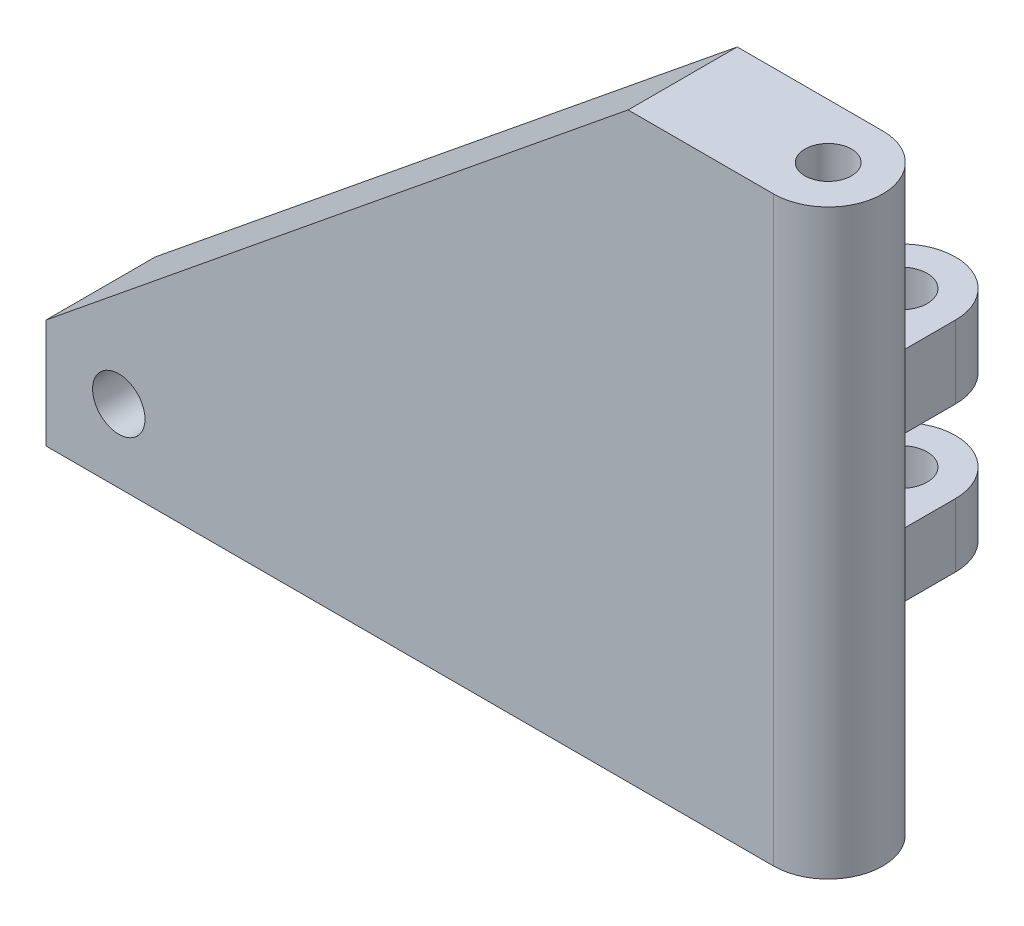
ISO-10303-21;
HEADER;
FILE_DESCRIPTION(('STEP AP214'),'2;1');
FILE_NAME('part.step','',(''),(''),'','','');
FILE_SCHEMA(('AUTOMOTIVE_DESIGN { 1 0 10303 214 1 1 1 1 }'));
ENDSEC;
DATA;
#1=APPLICATION_CONTEXT('core data for automotive mechanical design processes');
#2=APPLICATION_PROTOCOL_DEFINITION('international standard','automotive_design',2000,#1);
#3=PRODUCT_CONTEXT('',#1,'mechanical');
#4=PRODUCT('Part','Part','',(#3));
#5=PRODUCT_RELATED_PRODUCT_CATEGORY('part','',(#4));
#6=PRODUCT_DEFINITION_FORMATION('','',#4);
#7=PRODUCT_DEFINITION_CONTEXT('part definition',#1,'design');
#8=PRODUCT_DEFINITION('design','',#6,#7);
#9=PRODUCT_DEFINITION_SHAPE('','',#8);
#10=(LENGTH_UNIT() NAMED_UNIT(*) SI_UNIT(.MILLI.,.METRE.));
#11=(NAMED_UNIT(*) PLANE_ANGLE_UNIT() SI_UNIT($,.RADIAN.));
#12=(NAMED_UNIT(*) SI_UNIT($,.STERADIAN.) SOLID_ANGLE_UNIT());
#13=UNCERTAINTY_MEASURE_WITH_UNIT(LENGTH_MEASURE(1.E-05),#10,'distance_accuracy_value','');
#14=(GEOMETRIC_REPRESENTATION_CONTEXT(3) GLOBAL_UNCERTAINTY_ASSIGNED_CONTEXT((#13)) GLOBAL_UNIT_ASSIGNED_CONTEXT((#10,
#11,#12)) REPRESENTATION_CONTEXT('',''));
#15=CARTESIAN_POINT('',(0.,0.,0.));
#16=DIRECTION('',(0.,0.,1.));
#17=DIRECTION('',(1.,0.,0.));
#18=AXIS2_PLACEMENT_3D('',#15,#16,#17);
#19=CARTESIAN_POINT('',(-19.05,-6.35,-25.4));
#20=DIRECTION('',(0.,-1.,0.));
#21=DIRECTION('',(0.,0.,-1.));
#22=AXIS2_PLACEMENT_3D('',#19,#20,#21);
#23=CYLINDRICAL_SURFACE('',#22,4.7625);
#24=CARTESIAN_POINT('',(-19.05,-19.84375,-25.4));
#25=DIRECTION('',(0.,1.,0.));
#26=DIRECTION('',(0.,0.,1.));
#27=AXIS2_PLACEMENT_3D('',#24,#25,#26);
#28=CIRCLE('',#27,4.7625);
#29=CARTESIAN_POINT('',(-14.2875,-19.84375,-25.4));
#30=VERTEX_POINT('',#29);
#31=CARTESIAN_POINT('',(-23.8125,-19.84375,-25.4));
#32=VERTEX_POINT('',#31);
#33=EDGE_CURVE('E333',#30,#32,#28,.T.);
#34=ORIENTED_EDGE('',*,*,#33,.F.);
#35=DIRECTION('',(0.,-1.,0.));
#36=VECTOR('',#35,1.);
#37=CARTESIAN_POINT('',(-14.2875,-6.35,-25.4));
#38=LINE('',#37,#36);
#39=CARTESIAN_POINT('',(-14.2875,-25.4,-25.4));
#40=VERTEX_POINT('',#39);
#41=EDGE_CURVE('E275',#30,#40,#38,.T.);
#42=ORIENTED_EDGE('',*,*,#41,.T.);
#43=CARTESIAN_POINT('',(-19.05,-25.4,-25.4));
#44=DIRECTION('',(0.,1.,0.));
#45=DIRECTION('',(0.,0.,1.));
#46=AXIS2_PLACEMENT_3D('',#43,#44,#45);
#47=CIRCLE('',#46,4.7625);
#48=CARTESIAN_POINT('',(-23.8125,-25.4,-25.4));
#49=VERTEX_POINT('',#48);
#50=EDGE_CURVE('E255',#40,#49,#47,.T.);
#51=ORIENTED_EDGE('',*,*,#50,.T.);
#52=DIRECTION('',(0.,-1.,0.));
#53=VECTOR('',#52,1.);
#54=CARTESIAN_POINT('',(-23.8125,-6.35,-25.4));
#55=LINE('',#54,#53);
#56=EDGE_CURVE('E297',#32,#49,#55,.T.);
#57=ORIENTED_EDGE('',*,*,#56,.F.);
#58=EDGE_LOOP('',(#34,#42,#51,#57));
#59=FACE_BOUND('',#58,.T.);
#60=ADVANCED_FACE('F49',(#59),#23,.T.);
#61=CARTESIAN_POINT('',(-23.8125,-6.35,-25.4));
#62=DIRECTION('',(1.,0.,0.));
#63=DIRECTION('',(0.,0.,-1.));
#64=AXIS2_PLACEMENT_3D('',#61,#62,#63);
#65=PLANE('',#64);
#66=DIRECTION('',(0.,0.,1.));
#67=VECTOR('',#66,1.);
#68=CARTESIAN_POINT('',(-23.8125,-19.84375,-25.4));
#69=LINE('',#68,#67);
#70=CARTESIAN_POINT('',(-23.8125,-19.84375,-21.199869793685));
#71=VERTEX_POINT('',#70);
#72=EDGE_CURVE('E242',#32,#71,#69,.T.);
#73=ORIENTED_EDGE('',*,*,#72,.F.);
#74=ORIENTED_EDGE('',*,*,#56,.T.);
#75=DIRECTION('',(0.,0.,1.));
#76=VECTOR('',#75,1.);
#77=CARTESIAN_POINT('',(-23.8125,-25.4,-25.4));
#78=LINE('',#77,#76);
#79=CARTESIAN_POINT('',(-23.8125,-25.4,-4.7625));
#80=VERTEX_POINT('',#79);
#81=EDGE_CURVE('E279',#49,#80,#78,.T.);
#82=ORIENTED_EDGE('',*,*,#81,.T.);
#83=DIRECTION('',(0.,-1.,0.));
#84=VECTOR('',#83,1.);
#85=CARTESIAN_POINT('',(-23.8125,-6.35,-4.7625));
#86=LINE('',#85,#84);
#87=CARTESIAN_POINT('',(-23.8125,-6.35,-4.7625));
#88=VERTEX_POINT('',#87);
#89=EDGE_CURVE('E294',#88,#80,#86,.T.);
#90=ORIENTED_EDGE('',*,*,#89,.F.);
#91=DIRECTION('',(0.,0.,1.));
#92=VECTOR('',#91,1.);
#93=CARTESIAN_POINT('',(-23.8125,-6.35,-25.4));
#94=LINE('',#93,#92);
#95=CARTESIAN_POINT('',(-23.8125,-6.35,-25.4));
#96=VERTEX_POINT('',#95);
#97=EDGE_CURVE('E263',#96,#88,#94,.T.);
#98=ORIENTED_EDGE('',*,*,#97,.F.);
#99=CARTESIAN_POINT('',(-23.8125,-12.7,-25.4));
#100=VERTEX_POINT('',#99);
#101=EDGE_CURVE('E298',#96,#100,#55,.T.);
#102=ORIENTED_EDGE('',*,*,#101,.T.);
#103=DIRECTION('',(0.,0.,1.));
#104=VECTOR('',#103,1.);
#105=CARTESIAN_POINT('',(-23.8125,-12.7,-25.4));
#106=LINE('',#105,#104);
#107=CARTESIAN_POINT('',(-23.8125,-12.7,-21.199869793685));
#108=VERTEX_POINT('',#107);
#109=EDGE_CURVE('E237',#100,#108,#106,.T.);
#110=ORIENTED_EDGE('',*,*,#109,.T.);
#111=DIRECTION('',(0.,1.,0.));
#112=VECTOR('',#111,1.);
#113=CARTESIAN_POINT('',(-23.8125,-19.84375,-21.199869793685));
#114=LINE('',#113,#112);
#115=EDGE_CURVE('E219',#71,#108,#114,.T.);
#116=ORIENTED_EDGE('',*,*,#115,.F.);
#117=EDGE_LOOP('',(#73,#74,#82,#90,#98,#102,#110,#116));
#118=FACE_BOUND('',#117,.T.);
#119=ADVANCED_FACE('F354',(#118),#65,.F.);
#120=CARTESIAN_POINT('',(-14.2875,-6.35,-25.4));
#121=DIRECTION('',(-1.,0.,0.));
#122=DIRECTION('',(0.,0.,1.));
#123=AXIS2_PLACEMENT_3D('',#120,#121,#122);
#124=PLANE('',#123);
#125=DIRECTION('',(0.,0.,-1.));
#126=VECTOR('',#125,1.);
#127=CARTESIAN_POINT('',(-14.2875,-19.84375,-15.3180209242761));
#128=LINE('',#127,#126);
#129=CARTESIAN_POINT('',(-14.2875,-19.84375,-15.3180209242761));
#130=VERTEX_POINT('',#129);
#131=EDGE_CURVE('E330',#130,#30,#128,.T.);
#132=ORIENTED_EDGE('',*,*,#131,.F.);
#133=DIRECTION('',(0.,1.,0.));
#134=VECTOR('',#133,1.);
#135=CARTESIAN_POINT('',(-14.2875,-19.84375,-15.3180209242761));
#136=LINE('',#135,#134);
#137=CARTESIAN_POINT('',(-14.2875,-12.7,-15.3180209242761));
#138=VERTEX_POINT('',#137);
#139=EDGE_CURVE('E226',#130,#138,#136,.T.);
#140=ORIENTED_EDGE('',*,*,#139,.T.);
#141=DIRECTION('',(0.,0.,-1.));
#142=VECTOR('',#141,1.);
#143=CARTESIAN_POINT('',(-14.2875,-12.7,-15.3180209242761));
#144=LINE('',#143,#142);
#145=CARTESIAN_POINT('',(-14.2875,-12.7,-25.4));
#146=VERTEX_POINT('',#145);
#147=EDGE_CURVE('E345',#138,#146,#144,.T.);
#148=ORIENTED_EDGE('',*,*,#147,.T.);
#149=CARTESIAN_POINT('',(-14.2875,-6.35,-25.4));
#150=VERTEX_POINT('',#149);
#151=EDGE_CURVE('E286',#150,#146,#38,.T.);
#152=ORIENTED_EDGE('',*,*,#151,.F.);
#153=DIRECTION('',(0.,0.,-1.));
#154=VECTOR('',#153,1.);
#155=CARTESIAN_POINT('',(-14.2875,-6.35,-25.4));
#156=LINE('',#155,#154);
#157=CARTESIAN_POINT('',(-14.2875,-6.35,-4.7625));
#158=VERTEX_POINT('',#157);
#159=EDGE_CURVE('E272',#158,#150,#156,.T.);
#160=ORIENTED_EDGE('',*,*,#159,.F.);
#161=DIRECTION('',(0.,-1.,0.));
#162=VECTOR('',#161,1.);
#163=CARTESIAN_POINT('',(-14.2875,-6.35,-4.7625));
#164=LINE('',#163,#162);
#165=CARTESIAN_POINT('',(-14.2875,-25.4,-4.7625));
#166=VERTEX_POINT('',#165);
#167=EDGE_CURVE('E290',#158,#166,#164,.T.);
#168=ORIENTED_EDGE('',*,*,#167,.T.);
#169=DIRECTION('',(0.,0.,-1.));
#170=VECTOR('',#169,1.);
#171=CARTESIAN_POINT('',(-14.2875,-25.4,-25.4));
#172=LINE('',#171,#170);
#173=EDGE_CURVE('E264',#166,#40,#172,.T.);
#174=ORIENTED_EDGE('',*,*,#173,.T.);
#175=ORIENTED_EDGE('',*,*,#41,.F.);
#176=EDGE_LOOP('',(#132,#140,#148,#152,#160,#168,#174,#175));
#177=FACE_BOUND('',#176,.T.);
#178=ADVANCED_FACE('F374',(#177),#124,.F.);
#179=CARTESIAN_POINT('',(-19.05,-6.35,-25.4));
#180=DIRECTION('',(0.,-1.,0.));
#181=DIRECTION('',(0.,0.,-1.));
#182=AXIS2_PLACEMENT_3D('',#179,#180,#181);
#183=CYLINDRICAL_SURFACE('',#182,2.286);
#184=CARTESIAN_POINT('',(-19.05,-25.4,-25.4));
#185=DIRECTION('',(0.,1.,0.));
#186=DIRECTION('',(0.,0.,1.));
#187=AXIS2_PLACEMENT_3D('',#184,#185,#186);
#188=CIRCLE('',#187,2.286);
#189=CARTESIAN_POINT('',(-19.05,-25.4,-27.686));
#190=VERTEX_POINT('',#189);
#191=EDGE_CURVE('E250',#190,#190,#188,.T.);
#192=CARTESIAN_POINT('',(-19.05,-19.84375,-25.4));
#193=DIRECTION('',(0.,1.,0.));
#194=DIRECTION('',(0.,0.,1.));
#195=AXIS2_PLACEMENT_3D('',#192,#193,#194);
#196=CIRCLE('',#195,2.286);
#197=CARTESIAN_POINT('',(-19.05,-19.84375,-27.686));
#198=VERTEX_POINT('',#197);
#199=EDGE_CURVE('E53',#198,#198,#196,.T.);
#200=CARTESIAN_POINT('',(-19.05,-25.4,-27.686));
#201=CARTESIAN_POINT('',(-19.05,-25.3421223958333,-27.686));
#202=CARTESIAN_POINT('',(-19.05,-25.2842447916667,-27.686));
#203=CARTESIAN_POINT('',(-19.05,-25.1684895833333,-27.686));
#204=CARTESIAN_POINT('',(-19.05,-25.1106119791667,-27.686));
#205=CARTESIAN_POINT('',(-19.05,-24.9948567708333,-27.686));
#206=CARTESIAN_POINT('',(-19.05,-24.9369791666667,-27.686));
#207=CARTESIAN_POINT('',(-19.05,-24.8212239583333,-27.686));
#208=CARTESIAN_POINT('',(-19.05,-24.7633463541667,-27.686));
#209=CARTESIAN_POINT('',(-19.05,-24.6475911458333,-27.686));
#210=CARTESIAN_POINT('',(-19.05,-24.5897135416667,-27.686));
#211=CARTESIAN_POINT('',(-19.05,-24.4739583333333,-27.686));
#212=CARTESIAN_POINT('',(-19.05,-24.4160807291667,-27.686));
#213=CARTESIAN_POINT('',(-19.05,-24.3003255208333,-27.686));
#214=CARTESIAN_POINT('',(-19.05,-24.2424479166667,-27.686));
#215=CARTESIAN_POINT('',(-19.05,-24.1266927083333,-27.686));
#216=CARTESIAN_POINT('',(-19.05,-24.0688151041667,-27.686));
#217=CARTESIAN_POINT('',(-19.05,-23.9530598958333,-27.686));
#218=CARTESIAN_POINT('',(-19.05,-23.8951822916667,-27.686));
#219=CARTESIAN_POINT('',(-19.05,-23.7794270833333,-27.686));
#220=CARTESIAN_POINT('',(-19.05,-23.7215494791667,-27.686));
#221=CARTESIAN_POINT('',(-19.05,-23.6057942708333,-27.686));
#222=CARTESIAN_POINT('',(-19.05,-23.5479166666667,-27.686));
#223=CARTESIAN_POINT('',(-19.05,-23.4321614583333,-27.686));
#224=CARTESIAN_POINT('',(-19.05,-23.3742838541667,-27.686));
#225=CARTESIAN_POINT('',(-19.05,-23.2585286458333,-27.686));
#226=CARTESIAN_POINT('',(-19.05,-23.2006510416667,-27.686));
#227=CARTESIAN_POINT('',(-19.05,-23.0848958333333,-27.686));
#228=CARTESIAN_POINT('',(-19.05,-23.0270182291667,-27.686));
#229=CARTESIAN_POINT('',(-19.05,-22.9112630208333,-27.686));
#230=CARTESIAN_POINT('',(-19.05,-22.8533854166667,-27.686));
#231=CARTESIAN_POINT('',(-19.05,-22.7376302083333,-27.686));
#232=CARTESIAN_POINT('',(-19.05,-22.6797526041667,-27.686));
#233=CARTESIAN_POINT('',(-19.05,-22.5639973958333,-27.686));
#234=CARTESIAN_POINT('',(-19.05,-22.5061197916667,-27.686));
#235=CARTESIAN_POINT('',(-19.05,-22.3903645833333,-27.686));
#236=CARTESIAN_POINT('',(-19.05,-22.3324869791667,-27.686));
#237=CARTESIAN_POINT('',(-19.05,-22.2167317708333,-27.686));
#238=CARTESIAN_POINT('',(-19.05,-22.1588541666667,-27.686));
#239=CARTESIAN_POINT('',(-19.05,-22.0430989583333,-27.686));
#240=CARTESIAN_POINT('',(-19.05,-21.9852213541667,-27.686));
#241=CARTESIAN_POINT('',(-19.05,-21.8694661458333,-27.686));
#242=CARTESIAN_POINT('',(-19.05,-21.8115885416667,-27.686));
#243=CARTESIAN_POINT('',(-19.05,-21.6958333333333,-27.686));
#244=CARTESIAN_POINT('',(-19.05,-21.6379557291667,-27.686));
#245=CARTESIAN_POINT('',(-19.05,-21.5222005208333,-27.686));
#246=CARTESIAN_POINT('',(-19.05,-21.4643229166667,-27.686));
#247=CARTESIAN_POINT('',(-19.05,-21.3485677083333,-27.686));
#248=CARTESIAN_POINT('',(-19.05,-21.2906901041667,-27.686));
#249=CARTESIAN_POINT('',(-19.05,-21.1749348958333,-27.686));
#250=CARTESIAN_POINT('',(-19.05,-21.1170572916667,-27.686));
#251=CARTESIAN_POINT('',(-19.05,-21.0013020833333,-27.686));
#252=CARTESIAN_POINT('',(-19.05,-20.9434244791667,-27.686));
#253=CARTESIAN_POINT('',(-19.05,-20.8276692708333,-27.686));
#254=CARTESIAN_POINT('',(-19.05,-20.7697916666667,-27.686));
#255=CARTESIAN_POINT('',(-19.05,-20.6540364583333,-27.686));
#256=CARTESIAN_POINT('',(-19.05,-20.5961588541667,-27.686));
#257=CARTESIAN_POINT('',(-19.05,-20.4804036458333,-27.686));
#258=CARTESIAN_POINT('',(-19.05,-20.4225260416667,-27.686));
#259=CARTESIAN_POINT('',(-19.05,-20.3067708333333,-27.686));
#260=CARTESIAN_POINT('',(-19.05,-20.2488932291667,-27.686));
#261=CARTESIAN_POINT('',(-19.05,-20.1331380208333,-27.686));
#262=CARTESIAN_POINT('',(-19.05,-20.0752604166667,-27.686));
#263=CARTESIAN_POINT('',(-19.05,-19.9595052083333,-27.686));
#264=CARTESIAN_POINT('',(-19.05,-19.9016276041667,-27.686));
#265=CARTESIAN_POINT('',(-19.05,-19.84375,-27.686));
#266=B_SPLINE_CURVE_WITH_KNOTS('',3,(#200,#201,#202,#203,#204,#205,#206,#207,#208,#209,#210,
#211,#212,#213,#214,#215,#216,#217,#218,#219,#220,#221,#222,#223,#224,#225,#226,#227,#228,#229,
#230,#231,#232,#233,#234,#235,#236,#237,#238,#239,#240,#241,#242,#243,#244,#245,#246,#247,#248,
#249,#250,#251,#252,#253,#254,#255,#256,#257,#258,#259,#260,#261,#262,#263,#264,#265),
.UNSPECIFIED.,.F.,.F.,(4,2,2,2,2,2,2,2,2,2,2,2,2,2,2,2,2,2,2,2,2,2,2,2,2,2,2,2,2,2,2,2,4),(0.,
0.173632812500001,0.347265624999999,0.5208984375,0.694531249999998,0.868164062499999,
1.041796875,1.2154296875,1.3890625,1.5626953125,1.736328125,1.9099609375,2.08359375,
2.2572265625,2.430859375,2.6044921875,2.778125,2.9517578125,3.125390625,3.2990234375,3.47265625,
3.6462890625,3.819921875,3.9935546875,4.1671875,4.3408203125,4.514453125,4.6880859375,
4.86171875,5.0353515625,5.208984375,5.3826171875,5.55625),.UNSPECIFIED.);
#267=EDGE_CURVE('BSEAM399',#190,#198,#266,.T.);
#268=ORIENTED_EDGE('',*,*,#191,.F.);
#269=ORIENTED_EDGE('',*,*,#199,.T.);
#270=ORIENTED_EDGE('',*,*,#267,.T.);
#271=ORIENTED_EDGE('',*,*,#267,.F.);
#272=EDGE_LOOP('',(#268,#270,#269,#271));
#273=FACE_BOUND('',#272,.T.);
#274=ADVANCED_FACE('F399',(#273),#183,.F.);
#275=CARTESIAN_POINT('',(0.,25.4,-4.7625));
#276=DIRECTION('',(0.,0.,1.));
#277=DIRECTION('',(1.,0.,0.));
#278=AXIS2_PLACEMENT_3D('',#275,#276,#277);
#279=PLANE('',#278);
#280=CARTESIAN_POINT('',(-57.15,-19.05,-4.76249999999999));
#281=DIRECTION('',(0.,0.,1.));
#282=DIRECTION('',(1.,0.,0.));
#283=AXIS2_PLACEMENT_3D('',#280,#281,#282);
#284=CIRCLE('',#283,2.286);
#285=CARTESIAN_POINT('',(-54.864,-19.05,-4.76249999999999));
#286=VERTEX_POINT('',#285);
#287=EDGE_CURVE('E246',#286,#286,#284,.T.);
#288=ORIENTED_EDGE('',*,*,#287,.T.);
#289=EDGE_LOOP('',(#288));
#290=FACE_BOUND('',#289,.T.);
#291=DIRECTION('',(0.,-1.,0.));
#292=VECTOR('',#291,1.);
#293=CARTESIAN_POINT('',(-63.5,25.4,-4.76249999999999));
#294=LINE('',#293,#292);
#295=CARTESIAN_POINT('',(-63.5,-15.875,-4.76249999999999));
#296=VERTEX_POINT('',#295);
#297=CARTESIAN_POINT('',(-63.5,-25.4,-4.76249999999999));
#298=VERTEX_POINT('',#297);
#299=EDGE_CURVE('E59',#296,#298,#294,.T.);
#300=ORIENTED_EDGE('',*,*,#299,.F.);
#301=DIRECTION('',(-0.776114000116265,-0.630592625094466,0.));
#302=VECTOR('',#301,1.);
#303=CARTESIAN_POINT('',(-12.7,25.4,-4.7625));
#304=LINE('',#303,#302);
#305=CARTESIAN_POINT('',(-12.7,25.4,-4.7625));
#306=VERTEX_POINT('',#305);
#307=EDGE_CURVE('E171',#306,#296,#304,.T.);
#308=ORIENTED_EDGE('',*,*,#307,.F.);
#309=DIRECTION('',(-1.,0.,0.));
#310=VECTOR('',#309,1.);
#311=CARTESIAN_POINT('',(0.,25.4,-4.7625));
#312=LINE('',#311,#310);
#313=CARTESIAN_POINT('',(0.,25.4,-4.7625));
#314=VERTEX_POINT('',#313);
#315=EDGE_CURVE('E180',#314,#306,#312,.T.);
#316=ORIENTED_EDGE('',*,*,#315,.F.);
#317=DIRECTION('',(0.,-1.,0.));
#318=VECTOR('',#317,1.);
#319=CARTESIAN_POINT('',(0.,25.4,-4.7625));
#320=LINE('',#319,#318);
#321=CARTESIAN_POINT('',(0.,-25.4,-4.7625));
#322=VERTEX_POINT('',#321);
#323=EDGE_CURVE('E11',#314,#322,#320,.T.);
#324=ORIENTED_EDGE('',*,*,#323,.T.);
#325=DIRECTION('',(-1.,0.,0.));
#326=VECTOR('',#325,1.);
#327=CARTESIAN_POINT('',(0.,-25.4,-4.7625));
#328=LINE('',#327,#326);
#329=EDGE_CURVE('E203',#322,#166,#328,.T.);
#330=ORIENTED_EDGE('',*,*,#329,.T.);
#331=ORIENTED_EDGE('',*,*,#167,.F.);
#332=DIRECTION('',(1.,0.,0.));
#333=VECTOR('',#332,1.);
#334=CARTESIAN_POINT('',(-23.8125,-6.35,-4.7625));
#335=LINE('',#334,#333);
#336=EDGE_CURVE('E268',#88,#158,#335,.T.);
#337=ORIENTED_EDGE('',*,*,#336,.F.);
#338=ORIENTED_EDGE('',*,*,#89,.T.);
#339=EDGE_CURVE('E201',#80,#298,#328,.T.);
#340=ORIENTED_EDGE('',*,*,#339,.T.);
#341=EDGE_LOOP('',(#300,#308,#316,#324,#330,#331,#337,#338,#340));
#342=FACE_BOUND('',#341,.T.);
#343=ADVANCED_FACE('F314',(#290,#342),#279,.F.);
#344=CARTESIAN_POINT('',(0.,25.4,0.));
#345=DIRECTION('',(0.,1.,0.));
#346=DIRECTION('',(0.,0.,1.));
#347=AXIS2_PLACEMENT_3D('',#344,#345,#346);
#348=PLANE('',#347);
#349=DIRECTION('',(0.,0.,-1.));
#350=VECTOR('',#349,1.);
#351=CARTESIAN_POINT('',(-12.7,25.4,4.76250000000001));
#352=LINE('',#351,#350);
#353=CARTESIAN_POINT('',(-12.7,25.4,4.76250000000001));
#354=VERTEX_POINT('',#353);
#355=EDGE_CURVE('E165',#354,#306,#352,.T.);
#356=ORIENTED_EDGE('',*,*,#355,.F.);
#357=DIRECTION('',(1.,0.,0.));
#358=VECTOR('',#357,1.);
#359=CARTESIAN_POINT('',(0.,25.4,4.7625));
#360=LINE('',#359,#358);
#361=CARTESIAN_POINT('',(0.,25.4,4.7625));
#362=VERTEX_POINT('',#361);
#363=EDGE_CURVE('E178',#354,#362,#360,.T.);
#364=ORIENTED_EDGE('',*,*,#363,.T.);
#365=CARTESIAN_POINT('',(0.,25.4,0.));
#366=DIRECTION('',(0.,1.,0.));
#367=DIRECTION('',(0.,0.,1.));
#368=AXIS2_PLACEMENT_3D('',#365,#366,#367);
#369=CIRCLE('',#368,4.7625);
#370=EDGE_CURVE('E193',#362,#314,#369,.T.);
#371=ORIENTED_EDGE('',*,*,#370,.T.);
#372=ORIENTED_EDGE('',*,*,#315,.T.);
#373=EDGE_LOOP('',(#356,#364,#371,#372));
#374=FACE_BOUND('',#373,.T.);
#375=CARTESIAN_POINT('',(0.,25.4,0.));
#376=DIRECTION('',(0.,1.,0.));
#377=DIRECTION('',(0.,0.,1.));
#378=AXIS2_PLACEMENT_3D('',#375,#376,#377);
#379=CIRCLE('',#378,2.032);
#380=CARTESIAN_POINT('',(0.,25.4,2.032));
#381=VERTEX_POINT('',#380);
#382=EDGE_CURVE('E202',#381,#381,#379,.T.);
#383=ORIENTED_EDGE('',*,*,#382,.F.);
#384=EDGE_LOOP('',(#383));
#385=FACE_BOUND('',#384,.T.);
#386=ADVANCED_FACE('F175',(#374,#385),#348,.T.);
#387=CARTESIAN_POINT('',(0.,-25.4,0.));
#388=DIRECTION('',(0.,1.,0.));
#389=DIRECTION('',(0.,0.,1.));
#390=AXIS2_PLACEMENT_3D('',#387,#388,#389);
#391=PLANE('',#390);
#392=CARTESIAN_POINT('',(0.,-25.4,0.));
#393=DIRECTION('',(0.,1.,0.));
#394=DIRECTION('',(0.,0.,1.));
#395=AXIS2_PLACEMENT_3D('',#392,#393,#394);
#396=CIRCLE('',#395,4.7625);
#397=CARTESIAN_POINT('',(0.,-25.4,4.7625));
#398=VERTEX_POINT('',#397);
#399=EDGE_CURVE('E197',#398,#322,#396,.T.);
#400=ORIENTED_EDGE('',*,*,#399,.F.);
#401=DIRECTION('',(1.,0.,0.));
#402=VECTOR('',#401,1.);
#403=CARTESIAN_POINT('',(0.,-25.4,4.7625));
#404=LINE('',#403,#402);
#405=CARTESIAN_POINT('',(-63.5,-25.4,4.76250000000001));
#406=VERTEX_POINT('',#405);
#407=EDGE_CURVE('E210',#406,#398,#404,.T.);
#408=ORIENTED_EDGE('',*,*,#407,.F.);
#409=DIRECTION('',(0.,0.,1.));
#410=VECTOR('',#409,1.);
#411=CARTESIAN_POINT('',(-63.5,-25.4,-4.76249999999999));
#412=LINE('',#411,#410);
#413=EDGE_CURVE('E206',#298,#406,#412,.T.);
#414=ORIENTED_EDGE('',*,*,#413,.F.);
#415=ORIENTED_EDGE('',*,*,#339,.F.);
#416=ORIENTED_EDGE('',*,*,#81,.F.);
#417=ORIENTED_EDGE('',*,*,#50,.F.);
#418=ORIENTED_EDGE('',*,*,#173,.F.);
#419=ORIENTED_EDGE('',*,*,#329,.F.);
#420=EDGE_LOOP('',(#400,#408,#414,#415,#416,#417,#418,#419));
#421=FACE_BOUND('',#420,.T.);
#422=CARTESIAN_POINT('',(0.,-25.4,0.));
#423=DIRECTION('',(0.,1.,0.));
#424=DIRECTION('',(0.,0.,1.));
#425=AXIS2_PLACEMENT_3D('',#422,#423,#424);
#426=CIRCLE('',#425,2.032);
#427=CARTESIAN_POINT('',(0.,-25.4,2.032));
#428=VERTEX_POINT('',#427);
#429=EDGE_CURVE('E302',#428,#428,#426,.T.);
#430=ORIENTED_EDGE('',*,*,#429,.T.);
#431=EDGE_LOOP('',(#430));
#432=FACE_BOUND('',#431,.T.);
#433=ORIENTED_EDGE('',*,*,#191,.T.);
#434=EDGE_LOOP('',(#433));
#435=FACE_BOUND('',#434,.T.);
#436=ADVANCED_FACE('F377',(#421,#432,#435),#391,.F.);
#437=CARTESIAN_POINT('',(0.,25.4,0.));
#438=DIRECTION('',(0.,-1.,0.));
#439=DIRECTION('',(0.,0.,-1.));
#440=AXIS2_PLACEMENT_3D('',#437,#438,#439);
#441=CYLINDRICAL_SURFACE('',#440,4.7625);
#442=ORIENTED_EDGE('',*,*,#399,.T.);
#443=ORIENTED_EDGE('',*,*,#323,.F.);
#444=ORIENTED_EDGE('',*,*,#370,.F.);
#445=DIRECTION('',(0.,-1.,0.));
#446=VECTOR('',#445,1.);
#447=CARTESIAN_POINT('',(0.,25.4,4.7625));
#448=LINE('',#447,#446);
#449=EDGE_CURVE('E185',#362,#398,#448,.T.);
#450=ORIENTED_EDGE('',*,*,#449,.T.);
#451=EDGE_LOOP('',(#442,#443,#444,#450));
#452=FACE_BOUND('',#451,.T.);
#453=ADVANCED_FACE('F51',(#452),#441,.T.);
#454=CARTESIAN_POINT('',(-63.5,25.4,-4.76249999999999));
#455=DIRECTION('',(1.,0.,0.));
#456=DIRECTION('',(0.,0.,-1.));
#457=AXIS2_PLACEMENT_3D('',#454,#455,#456);
#458=PLANE('',#457);
#459=DIRECTION('',(0.,-1.,0.));
#460=VECTOR('',#459,1.);
#461=CARTESIAN_POINT('',(-63.5,25.4,4.76250000000001));
#462=LINE('',#461,#460);
#463=CARTESIAN_POINT('',(-63.5,-15.875,4.76250000000001));
#464=VERTEX_POINT('',#463);
#465=EDGE_CURVE('E191',#464,#406,#462,.T.);
#466=ORIENTED_EDGE('',*,*,#465,.F.);
#467=DIRECTION('',(0.,0.,-1.));
#468=VECTOR('',#467,1.);
#469=CARTESIAN_POINT('',(-63.5,-15.875,4.76250000000002));
#470=LINE('',#469,#468);
#471=EDGE_CURVE('E67',#464,#296,#470,.T.);
#472=ORIENTED_EDGE('',*,*,#471,.T.);
#473=ORIENTED_EDGE('',*,*,#299,.T.);
#474=ORIENTED_EDGE('',*,*,#413,.T.);
#475=EDGE_LOOP('',(#466,#472,#473,#474));
#476=FACE_BOUND('',#475,.T.);
#477=ADVANCED_FACE('F434',(#476),#458,.F.);
#478=CARTESIAN_POINT('',(0.,25.4,4.7625));
#479=DIRECTION('',(0.,0.,-1.));
#480=DIRECTION('',(-1.,0.,0.));
#481=AXIS2_PLACEMENT_3D('',#478,#479,#480);
#482=PLANE('',#481);
#483=CARTESIAN_POINT('',(-57.15,-19.05,4.7625));
#484=DIRECTION('',(0.,0.,1.));
#485=DIRECTION('',(1.,0.,0.));
#486=AXIS2_PLACEMENT_3D('',#483,#484,#485);
#487=CIRCLE('',#486,2.286);
#488=CARTESIAN_POINT('',(-54.864,-19.05,4.7625));
#489=VERTEX_POINT('',#488);
#490=EDGE_CURVE('E225',#489,#489,#487,.T.);
#491=ORIENTED_EDGE('',*,*,#490,.F.);
#492=EDGE_LOOP('',(#491));
#493=FACE_BOUND('',#492,.T.);
#494=ORIENTED_EDGE('',*,*,#363,.F.);
#495=DIRECTION('',(-0.776114000116265,-0.630592625094466,0.));
#496=VECTOR('',#495,1.);
#497=CARTESIAN_POINT('',(-12.7,25.4,4.76250000000001));
#498=LINE('',#497,#496);
#499=EDGE_CURVE('E162',#354,#464,#498,.T.);
#500=ORIENTED_EDGE('',*,*,#499,.T.);
#501=ORIENTED_EDGE('',*,*,#465,.T.);
#502=ORIENTED_EDGE('',*,*,#407,.T.);
#503=ORIENTED_EDGE('',*,*,#449,.F.);
#504=EDGE_LOOP('',(#494,#500,#501,#502,#503));
#505=FACE_BOUND('',#504,.T.);
#506=ADVANCED_FACE('F183',(#493,#505),#482,.F.);
#507=CARTESIAN_POINT('',(0.,25.4,0.));
#508=DIRECTION('',(0.,-1.,0.));
#509=DIRECTION('',(0.,0.,-1.));
#510=AXIS2_PLACEMENT_3D('',#507,#508,#509);
#511=CYLINDRICAL_SURFACE('',#510,2.032);
#512=ORIENTED_EDGE('',*,*,#382,.T.);
#513=EDGE_LOOP('',(#512));
#514=FACE_BOUND('',#513,.T.);
#515=ORIENTED_EDGE('',*,*,#429,.F.);
#516=EDGE_LOOP('',(#515));
#517=FACE_BOUND('',#516,.T.);
#518=ADVANCED_FACE('F401',(#514,#517),#511,.F.);
#519=CARTESIAN_POINT('',(-19.05,-6.35,-25.4));
#520=DIRECTION('',(0.,1.,0.));
#521=DIRECTION('',(0.,0.,1.));
#522=AXIS2_PLACEMENT_3D('',#519,#520,#521);
#523=PLANE('',#522);
#524=CARTESIAN_POINT('',(-19.05,-6.35,-25.4));
#525=DIRECTION('',(0.,1.,0.));
#526=DIRECTION('',(0.,0.,1.));
#527=AXIS2_PLACEMENT_3D('',#524,#525,#526);
#528=CIRCLE('',#527,4.7625);
#529=EDGE_CURVE('E259',#150,#96,#528,.T.);
#530=ORIENTED_EDGE('',*,*,#529,.T.);
#531=ORIENTED_EDGE('',*,*,#97,.T.);
#532=ORIENTED_EDGE('',*,*,#336,.T.);
#533=ORIENTED_EDGE('',*,*,#159,.T.);
#534=EDGE_LOOP('',(#530,#531,#532,#533));
#535=FACE_BOUND('',#534,.T.);
#536=CARTESIAN_POINT('',(-19.05,-6.35,-25.4));
#537=DIRECTION('',(0.,1.,0.));
#538=DIRECTION('',(0.,0.,1.));
#539=AXIS2_PLACEMENT_3D('',#536,#537,#538);
#540=CIRCLE('',#539,2.286);
#541=CARTESIAN_POINT('',(-19.05,-6.35,-27.686));
#542=VERTEX_POINT('',#541);
#543=EDGE_CURVE('E251',#542,#542,#540,.T.);
#544=ORIENTED_EDGE('',*,*,#543,.F.);
#545=EDGE_LOOP('',(#544));
#546=FACE_BOUND('',#545,.T.);
#547=ADVANCED_FACE('F383',(#535,#546),#523,.T.);
#548=ORIENTED_EDGE('',*,*,#151,.T.);
#549=CARTESIAN_POINT('',(-19.05,-12.7,-25.4));
#550=DIRECTION('',(0.,1.,0.));
#551=DIRECTION('',(0.,0.,1.));
#552=AXIS2_PLACEMENT_3D('',#549,#550,#551);
#553=CIRCLE('',#552,4.7625);
#554=EDGE_CURVE('E77',#146,#100,#553,.T.);
#555=ORIENTED_EDGE('',*,*,#554,.T.);
#556=ORIENTED_EDGE('',*,*,#101,.F.);
#557=ORIENTED_EDGE('',*,*,#529,.F.);
#558=EDGE_LOOP('',(#548,#555,#556,#557));
#559=FACE_BOUND('',#558,.T.);
#560=ADVANCED_FACE('F387',(#559),#23,.T.);
#561=CARTESIAN_POINT('',(-19.05,-12.7,-25.4));
#562=DIRECTION('',(0.,1.,0.));
#563=DIRECTION('',(0.,0.,1.));
#564=AXIS2_PLACEMENT_3D('',#561,#562,#563);
#565=CIRCLE('',#564,2.286);
#566=CARTESIAN_POINT('',(-19.05,-12.7,-27.686));
#567=VERTEX_POINT('',#566);
#568=EDGE_CURVE('E216',#567,#567,#565,.T.);
#569=CARTESIAN_POINT('',(-19.05,-12.7,-27.686));
#570=CARTESIAN_POINT('',(-19.05,-12.6338541666667,-27.686));
#571=CARTESIAN_POINT('',(-19.05,-12.5677083333333,-27.686));
#572=CARTESIAN_POINT('',(-19.05,-12.4354166666667,-27.686));
#573=CARTESIAN_POINT('',(-19.05,-12.3692708333333,-27.686));
#574=CARTESIAN_POINT('',(-19.05,-12.2369791666667,-27.686));
#575=CARTESIAN_POINT('',(-19.05,-12.1708333333333,-27.686));
#576=CARTESIAN_POINT('',(-19.05,-12.0385416666667,-27.686));
#577=CARTESIAN_POINT('',(-19.05,-11.9723958333333,-27.686));
#578=CARTESIAN_POINT('',(-19.05,-11.8401041666667,-27.686));
#579=CARTESIAN_POINT('',(-19.05,-11.7739583333333,-27.686));
#580=CARTESIAN_POINT('',(-19.05,-11.6416666666667,-27.686));
#581=CARTESIAN_POINT('',(-19.05,-11.5755208333333,-27.686));
#582=CARTESIAN_POINT('',(-19.05,-11.4432291666667,-27.686));
#583=CARTESIAN_POINT('',(-19.05,-11.3770833333333,-27.686));
#584=CARTESIAN_POINT('',(-19.05,-11.2447916666667,-27.686));
#585=CARTESIAN_POINT('',(-19.05,-11.1786458333333,-27.686));
#586=CARTESIAN_POINT('',(-19.05,-11.0463541666667,-27.686));
#587=CARTESIAN_POINT('',(-19.05,-10.9802083333333,-27.686));
#588=CARTESIAN_POINT('',(-19.05,-10.8479166666667,-27.686));
#589=CARTESIAN_POINT('',(-19.05,-10.7817708333333,-27.686));
#590=CARTESIAN_POINT('',(-19.05,-10.6494791666667,-27.686));
#591=CARTESIAN_POINT('',(-19.05,-10.5833333333333,-27.686));
#592=CARTESIAN_POINT('',(-19.05,-10.4510416666667,-27.686));
#593=CARTESIAN_POINT('',(-19.05,-10.3848958333333,-27.686));
#594=CARTESIAN_POINT('',(-19.05,-10.2526041666667,-27.686));
#595=CARTESIAN_POINT('',(-19.05,-10.1864583333333,-27.686));
#596=CARTESIAN_POINT('',(-19.05,-10.0541666666667,-27.686));
#597=CARTESIAN_POINT('',(-19.05,-9.98802083333333,-27.686));
#598=CARTESIAN_POINT('',(-19.05,-9.85572916666667,-27.686));
#599=CARTESIAN_POINT('',(-19.05,-9.78958333333333,-27.686));
#600=CARTESIAN_POINT('',(-19.05,-9.65729166666667,-27.686));
#601=CARTESIAN_POINT('',(-19.05,-9.59114583333333,-27.686));
#602=CARTESIAN_POINT('',(-19.05,-9.45885416666667,-27.686));
#603=CARTESIAN_POINT('',(-19.05,-9.39270833333333,-27.686));
#604=CARTESIAN_POINT('',(-19.05,-9.26041666666667,-27.686));
#605=CARTESIAN_POINT('',(-19.05,-9.19427083333333,-27.686));
#606=CARTESIAN_POINT('',(-19.05,-9.06197916666667,-27.686));
#607=CARTESIAN_POINT('',(-19.05,-8.99583333333333,-27.686));
#608=CARTESIAN_POINT('',(-19.05,-8.86354166666666,-27.686));
#609=CARTESIAN_POINT('',(-19.05,-8.79739583333333,-27.686));
#610=CARTESIAN_POINT('',(-19.05,-8.66510416666667,-27.686));
#611=CARTESIAN_POINT('',(-19.05,-8.59895833333333,-27.686));
#612=CARTESIAN_POINT('',(-19.05,-8.46666666666667,-27.686));
#613=CARTESIAN_POINT('',(-19.05,-8.40052083333333,-27.686));
#614=CARTESIAN_POINT('',(-19.05,-8.26822916666666,-27.686));
#615=CARTESIAN_POINT('',(-19.05,-8.20208333333333,-27.686));
#616=CARTESIAN_POINT('',(-19.05,-8.06979166666667,-27.686));
#617=CARTESIAN_POINT('',(-19.05,-8.00364583333333,-27.686));
#618=CARTESIAN_POINT('',(-19.05,-7.87135416666667,-27.686));
#619=CARTESIAN_POINT('',(-19.05,-7.80520833333333,-27.686));
#620=CARTESIAN_POINT('',(-19.05,-7.67291666666667,-27.686));
#621=CARTESIAN_POINT('',(-19.05,-7.60677083333333,-27.686));
#622=CARTESIAN_POINT('',(-19.05,-7.47447916666667,-27.686));
#623=CARTESIAN_POINT('',(-19.05,-7.40833333333333,-27.686));
#624=CARTESIAN_POINT('',(-19.05,-7.27604166666667,-27.686));
#625=CARTESIAN_POINT('',(-19.05,-7.20989583333333,-27.686));
#626=CARTESIAN_POINT('',(-19.05,-7.07760416666667,-27.686));
#627=CARTESIAN_POINT('',(-19.05,-7.01145833333333,-27.686));
#628=CARTESIAN_POINT('',(-19.05,-6.87916666666667,-27.686));
#629=CARTESIAN_POINT('',(-19.05,-6.81302083333333,-27.686));
#630=CARTESIAN_POINT('',(-19.05,-6.68072916666666,-27.686));
#631=CARTESIAN_POINT('',(-19.05,-6.61458333333333,-27.686));
#632=CARTESIAN_POINT('',(-19.05,-6.48229166666667,-27.686));
#633=CARTESIAN_POINT('',(-19.05,-6.41614583333333,-27.686));
#634=CARTESIAN_POINT('',(-19.05,-6.35,-27.686));
#635=B_SPLINE_CURVE_WITH_KNOTS('',3,(#569,#570,#571,#572,#573,#574,#575,#576,#577,#578,#579,
#580,#581,#582,#583,#584,#585,#586,#587,#588,#589,#590,#591,#592,#593,#594,#595,#596,#597,#598,
#599,#600,#601,#602,#603,#604,#605,#606,#607,#608,#609,#610,#611,#612,#613,#614,#615,#616,#617,
#618,#619,#620,#621,#622,#623,#624,#625,#626,#627,#628,#629,#630,#631,#632,#633,#634),
.UNSPECIFIED.,.F.,.F.,(4,2,2,2,2,2,2,2,2,2,2,2,2,2,2,2,2,2,2,2,2,2,2,2,2,2,2,2,2,2,2,2,4),(0.,
0.198437499999999,0.396875,0.5953125,0.793749999999999,0.992187499999998,1.190625,1.3890625,
1.5875,1.7859375,1.984375,2.1828125,2.38125,2.5796875,2.778125,2.9765625,3.175,3.3734375,
3.571875,3.7703125,3.96875,4.1671875,4.365625,4.5640625,4.7625,4.9609375,5.159375,5.3578125,
5.55625,5.7546875,5.953125,6.1515625,6.35),.UNSPECIFIED.);
#636=EDGE_CURVE('BSEAM389',#567,#542,#635,.T.);
#637=ORIENTED_EDGE('',*,*,#568,.F.);
#638=ORIENTED_EDGE('',*,*,#543,.T.);
#639=ORIENTED_EDGE('',*,*,#636,.T.);
#640=ORIENTED_EDGE('',*,*,#636,.F.);
#641=EDGE_LOOP('',(#637,#639,#638,#640));
#642=FACE_BOUND('',#641,.T.);
#643=ADVANCED_FACE('F389',(#642),#183,.F.);
#644=CARTESIAN_POINT('',(-57.15,-19.05,-30.1625));
#645=DIRECTION('',(0.,0.,1.));
#646=DIRECTION('',(1.,0.,0.));
#647=AXIS2_PLACEMENT_3D('',#644,#645,#646);
#648=CYLINDRICAL_SURFACE('',#647,2.286);
#649=ORIENTED_EDGE('',*,*,#490,.T.);
#650=EDGE_LOOP('',(#649));
#651=FACE_BOUND('',#650,.T.);
#652=ORIENTED_EDGE('',*,*,#287,.F.);
#653=EDGE_LOOP('',(#652));
#654=FACE_BOUND('',#653,.T.);
#655=ADVANCED_FACE('F396',(#651,#654),#648,.F.);
#656=CARTESIAN_POINT('',(-19.05,-19.84375,-25.4));
#657=DIRECTION('',(0.,1.,0.));
#658=DIRECTION('',(0.,0.,1.));
#659=AXIS2_PLACEMENT_3D('',#656,#657,#658);
#660=CYLINDRICAL_SURFACE('',#659,6.35);
#661=CARTESIAN_POINT('',(-19.05,-12.7,-25.4));
#662=DIRECTION('',(0.,1.,0.));
#663=DIRECTION('',(0.,0.,1.));
#664=AXIS2_PLACEMENT_3D('',#661,#662,#663);
#665=CIRCLE('',#664,6.35);
#666=CARTESIAN_POINT('',(-22.225,-12.7,-19.9007386859688));
#667=VERTEX_POINT('',#666);
#668=EDGE_CURVE('E320',#108,#667,#665,.T.);
#669=ORIENTED_EDGE('',*,*,#668,.T.);
#670=DIRECTION('',(0.,1.,0.));
#671=VECTOR('',#670,1.);
#672=CARTESIAN_POINT('',(-22.225,-19.84375,-19.9007386859688));
#673=LINE('',#672,#671);
#674=CARTESIAN_POINT('',(-22.225,-19.84375,-19.9007386859688));
#675=VERTEX_POINT('',#674);
#676=EDGE_CURVE('E234',#675,#667,#673,.T.);
#677=ORIENTED_EDGE('',*,*,#676,.F.);
#678=CARTESIAN_POINT('',(-19.05,-19.84375,-25.4));
#679=DIRECTION('',(0.,1.,0.));
#680=DIRECTION('',(0.,0.,1.));
#681=AXIS2_PLACEMENT_3D('',#678,#679,#680);
#682=CIRCLE('',#681,6.35);
#683=EDGE_CURVE('E322',#71,#675,#682,.T.);
#684=ORIENTED_EDGE('',*,*,#683,.F.);
#685=ORIENTED_EDGE('',*,*,#115,.T.);
#686=EDGE_LOOP('',(#669,#677,#684,#685));
#687=FACE_BOUND('',#686,.T.);
#688=ADVANCED_FACE('F357',(#687),#660,.F.);
#689=CARTESIAN_POINT('',(-22.225,-19.84375,-19.9007386859688));
#690=DIRECTION('',(-0.500000000000004,0.,0.866025403784436));
#691=DIRECTION('',(0.866025403784436,0.,0.500000000000004));
#692=AXIS2_PLACEMENT_3D('',#689,#690,#691);
#693=PLANE('',#692);
#694=DIRECTION('',(0.866025403784436,0.,0.500000000000004));
#695=VECTOR('',#694,1.);
#696=CARTESIAN_POINT('',(-22.225,-12.7,-19.9007386859688));
#697=LINE('',#696,#695);
#698=EDGE_CURVE('E341',#667,#138,#697,.T.);
#699=ORIENTED_EDGE('',*,*,#698,.T.);
#700=ORIENTED_EDGE('',*,*,#139,.F.);
#701=DIRECTION('',(0.866025403784436,0.,0.500000000000004));
#702=VECTOR('',#701,1.);
#703=CARTESIAN_POINT('',(-22.225,-19.84375,-19.9007386859688));
#704=LINE('',#703,#702);
#705=EDGE_CURVE('E326',#675,#130,#704,.T.);
#706=ORIENTED_EDGE('',*,*,#705,.F.);
#707=ORIENTED_EDGE('',*,*,#676,.T.);
#708=EDGE_LOOP('',(#699,#700,#706,#707));
#709=FACE_BOUND('',#708,.T.);
#710=ADVANCED_FACE('F360',(#709),#693,.F.);
#711=CARTESIAN_POINT('',(-19.05,-19.84375,-25.4));
#712=DIRECTION('',(0.,1.,0.));
#713=DIRECTION('',(0.,0.,1.));
#714=AXIS2_PLACEMENT_3D('',#711,#712,#713);
#715=PLANE('',#714);
#716=ORIENTED_EDGE('',*,*,#199,.F.);
#717=EDGE_LOOP('',(#716));
#718=FACE_BOUND('',#717,.T.);
#719=ORIENTED_EDGE('',*,*,#683,.T.);
#720=ORIENTED_EDGE('',*,*,#705,.T.);
#721=ORIENTED_EDGE('',*,*,#131,.T.);
#722=ORIENTED_EDGE('',*,*,#33,.T.);
#723=ORIENTED_EDGE('',*,*,#72,.T.);
#724=EDGE_LOOP('',(#719,#720,#721,#722,#723));
#725=FACE_BOUND('',#724,.T.);
#726=ADVANCED_FACE('F363',(#718,#725),#715,.T.);
#727=CARTESIAN_POINT('',(-19.05,-12.7,-25.4));
#728=DIRECTION('',(0.,1.,0.));
#729=DIRECTION('',(0.,0.,1.));
#730=AXIS2_PLACEMENT_3D('',#727,#728,#729);
#731=PLANE('',#730);
#732=ORIENTED_EDGE('',*,*,#568,.T.);
#733=EDGE_LOOP('',(#732));
#734=FACE_BOUND('',#733,.T.);
#735=ORIENTED_EDGE('',*,*,#668,.F.);
#736=ORIENTED_EDGE('',*,*,#109,.F.);
#737=ORIENTED_EDGE('',*,*,#554,.F.);
#738=ORIENTED_EDGE('',*,*,#147,.F.);
#739=ORIENTED_EDGE('',*,*,#698,.F.);
#740=EDGE_LOOP('',(#735,#736,#737,#738,#739));
#741=FACE_BOUND('',#740,.T.);
#742=ADVANCED_FACE('F355',(#734,#741),#731,.F.);
#743=CARTESIAN_POINT('',(-12.7,25.4,4.76250000000001));
#744=DIRECTION('',(0.630592625094466,-0.776114000116266,0.));
#745=DIRECTION('',(0.776114000116266,0.630592625094466,0.));
#746=AXIS2_PLACEMENT_3D('',#743,#744,#745);
#747=PLANE('',#746);
#748=ORIENTED_EDGE('',*,*,#307,.T.);
#749=ORIENTED_EDGE('',*,*,#471,.F.);
#750=ORIENTED_EDGE('',*,*,#499,.F.);
#751=ORIENTED_EDGE('',*,*,#355,.T.);
#752=EDGE_LOOP('',(#748,#749,#750,#751));
#753=FACE_BOUND('',#752,.T.);
#754=ADVANCED_FACE('F164',(#753),#747,.F.);
#755=CLOSED_SHELL('',(#60,#119,#178,#274,#343,#386,#436,#453,#477,#506,#518,#547,#560,#643,#655,
#688,#710,#726,#742,#754));
#756=MANIFOLD_SOLID_BREP('B2',#755);
#757=ADVANCED_BREP_SHAPE_REPRESENTATION('',(#18,#756),#14);
#758=SHAPE_DEFINITION_REPRESENTATION(#9,#757);
ENDSEC;
END-ISO-10303-21;
